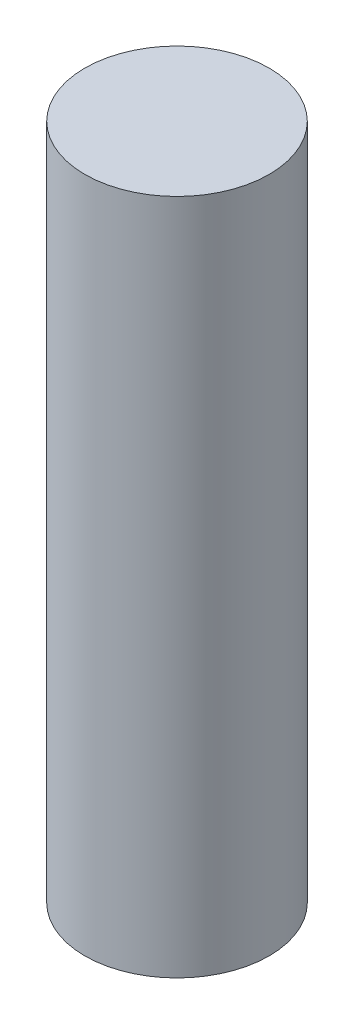
ISO-10303-21;
HEADER;
FILE_DESCRIPTION(('STEP AP214'),'2;1');
FILE_NAME('part.step','',(''),(''),'','','');
FILE_SCHEMA(('AUTOMOTIVE_DESIGN { 1 0 10303 214 1 1 1 1 }'));
ENDSEC;
DATA;
#1=APPLICATION_CONTEXT('core data for automotive mechanical design processes');
#2=APPLICATION_PROTOCOL_DEFINITION('international standard','automotive_design',2000,#1);
#3=PRODUCT_CONTEXT('',#1,'mechanical');
#4=PRODUCT('Part','Part','',(#3));
#5=PRODUCT_RELATED_PRODUCT_CATEGORY('part','',(#4));
#6=PRODUCT_DEFINITION_FORMATION('','',#4);
#7=PRODUCT_DEFINITION_CONTEXT('part definition',#1,'design');
#8=PRODUCT_DEFINITION('design','',#6,#7);
#9=PRODUCT_DEFINITION_SHAPE('','',#8);
#10=(LENGTH_UNIT() NAMED_UNIT(*) SI_UNIT(.MILLI.,.METRE.));
#11=(NAMED_UNIT(*) PLANE_ANGLE_UNIT() SI_UNIT($,.RADIAN.));
#12=(NAMED_UNIT(*) SI_UNIT($,.STERADIAN.) SOLID_ANGLE_UNIT());
#13=UNCERTAINTY_MEASURE_WITH_UNIT(LENGTH_MEASURE(1.E-05),#10,'distance_accuracy_value','');
#14=(GEOMETRIC_REPRESENTATION_CONTEXT(3) GLOBAL_UNCERTAINTY_ASSIGNED_CONTEXT((#13)) GLOBAL_UNIT_ASSIGNED_CONTEXT((#10,
#11,#12)) REPRESENTATION_CONTEXT('',''));
#15=CARTESIAN_POINT('',(0.,0.,0.));
#16=DIRECTION('',(0.,0.,1.));
#17=DIRECTION('',(1.,0.,0.));
#18=AXIS2_PLACEMENT_3D('',#15,#16,#17);
#19=CARTESIAN_POINT('',(0.,69.41,0.));
#20=DIRECTION('',(0.,-1.,0.));
#21=DIRECTION('',(0.,0.,-1.));
#22=AXIS2_PLACEMENT_3D('',#19,#20,#21);
#23=CYLINDRICAL_SURFACE('',#22,9.45);
#24=CARTESIAN_POINT('',(0.,69.41,0.));
#25=DIRECTION('',(0.,1.,0.));
#26=DIRECTION('',(0.,0.,1.));
#27=AXIS2_PLACEMENT_3D('',#24,#25,#26);
#28=CIRCLE('',#27,9.45);
#29=CARTESIAN_POINT('',(0.,69.41,9.45));
#30=VERTEX_POINT('',#29);
#31=EDGE_CURVE('E10',#30,#30,#28,.T.);
#32=ORIENTED_EDGE('',*,*,#31,.F.);
#33=EDGE_LOOP('',(#32));
#34=FACE_BOUND('',#33,.T.);
#35=CARTESIAN_POINT('',(0.,0.,0.));
#36=DIRECTION('',(0.,1.,0.));
#37=DIRECTION('',(0.,0.,1.));
#38=AXIS2_PLACEMENT_3D('',#35,#36,#37);
#39=CIRCLE('',#38,9.45);
#40=CARTESIAN_POINT('',(0.,0.,9.45));
#41=VERTEX_POINT('',#40);
#42=EDGE_CURVE('E40',#41,#41,#39,.T.);
#43=ORIENTED_EDGE('',*,*,#42,.T.);
#44=EDGE_LOOP('',(#43));
#45=FACE_BOUND('',#44,.T.);
#46=ADVANCED_FACE('F37',(#34,#45),#23,.T.);
#47=CARTESIAN_POINT('',(0.,69.41,0.));
#48=DIRECTION('',(0.,1.,0.));
#49=DIRECTION('',(0.,0.,1.));
#50=AXIS2_PLACEMENT_3D('',#47,#48,#49);
#51=PLANE('',#50);
#52=ORIENTED_EDGE('',*,*,#31,.T.);
#53=EDGE_LOOP('',(#52));
#54=FACE_BOUND('',#53,.T.);
#55=ADVANCED_FACE('F54',(#54),#51,.T.);
#56=CARTESIAN_POINT('',(0.,0.,0.));
#57=DIRECTION('',(0.,1.,0.));
#58=DIRECTION('',(0.,0.,1.));
#59=AXIS2_PLACEMENT_3D('',#56,#57,#58);
#60=PLANE('',#59);
#61=ORIENTED_EDGE('',*,*,#42,.F.);
#62=EDGE_LOOP('',(#61));
#63=FACE_BOUND('',#62,.T.);
#64=ADVANCED_FACE('F52',(#63),#60,.F.);
#65=CLOSED_SHELL('',(#46,#55,#64));
#66=MANIFOLD_SOLID_BREP('B2',#65);
#67=ADVANCED_BREP_SHAPE_REPRESENTATION('',(#18,#66),#14);
#68=SHAPE_DEFINITION_REPRESENTATION(#9,#67);
ENDSEC;
END-ISO-10303-21;
